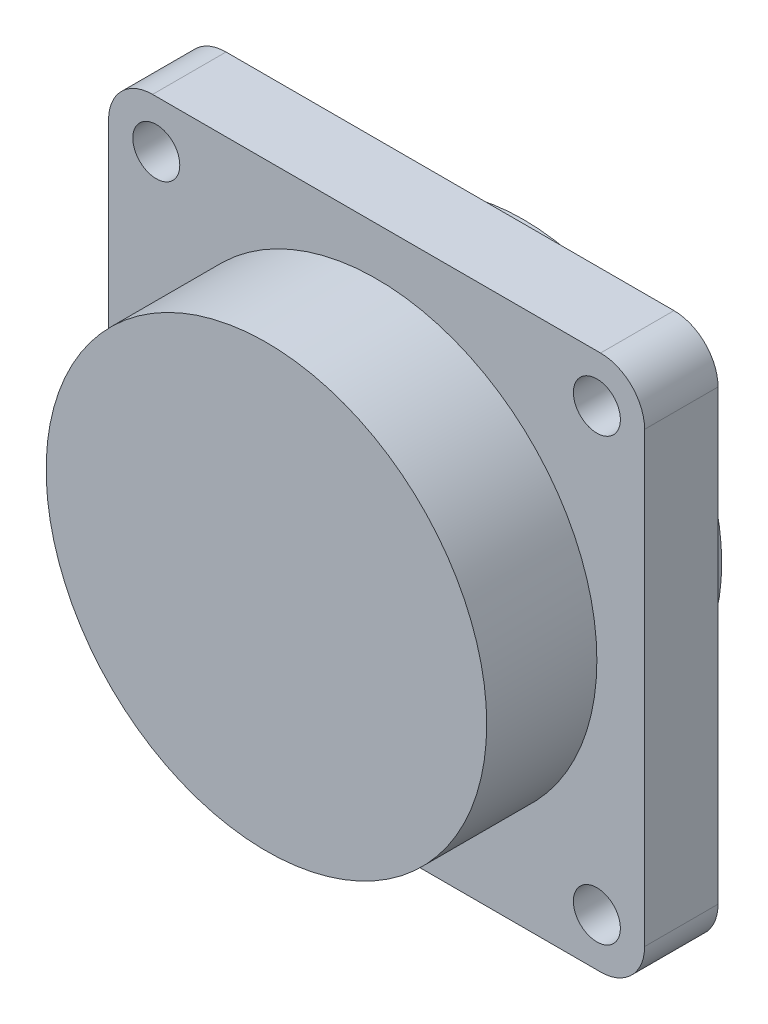
ISO-10303-21;
HEADER;
FILE_DESCRIPTION(('STEP AP214'),'2;1');
FILE_NAME('part.step','',(''),(''),'','','');
FILE_SCHEMA(('AUTOMOTIVE_DESIGN { 1 0 10303 214 1 1 1 1 }'));
ENDSEC;
DATA;
#1=APPLICATION_CONTEXT('core data for automotive mechanical design processes');
#2=APPLICATION_PROTOCOL_DEFINITION('international standard','automotive_design',2000,#1);
#3=PRODUCT_CONTEXT('',#1,'mechanical');
#4=PRODUCT('Part','Part','',(#3));
#5=PRODUCT_RELATED_PRODUCT_CATEGORY('part','',(#4));
#6=PRODUCT_DEFINITION_FORMATION('','',#4);
#7=PRODUCT_DEFINITION_CONTEXT('part definition',#1,'design');
#8=PRODUCT_DEFINITION('design','',#6,#7);
#9=PRODUCT_DEFINITION_SHAPE('','',#8);
#10=(LENGTH_UNIT() NAMED_UNIT(*) SI_UNIT(.MILLI.,.METRE.));
#11=(NAMED_UNIT(*) PLANE_ANGLE_UNIT() SI_UNIT($,.RADIAN.));
#12=(NAMED_UNIT(*) SI_UNIT($,.STERADIAN.) SOLID_ANGLE_UNIT());
#13=UNCERTAINTY_MEASURE_WITH_UNIT(LENGTH_MEASURE(1.E-05),#10,'distance_accuracy_value','');
#14=(GEOMETRIC_REPRESENTATION_CONTEXT(3) GLOBAL_UNCERTAINTY_ASSIGNED_CONTEXT((#13)) GLOBAL_UNIT_ASSIGNED_CONTEXT((#10,
#11,#12)) REPRESENTATION_CONTEXT('',''));
#15=CARTESIAN_POINT('',(0.,0.,0.));
#16=DIRECTION('',(0.,0.,1.));
#17=DIRECTION('',(1.,0.,0.));
#18=AXIS2_PLACEMENT_3D('',#15,#16,#17);
#19=CARTESIAN_POINT('',(-18.25,-18.25,0.));
#20=DIRECTION('',(0.,0.,1.));
#21=DIRECTION('',(1.,0.,0.));
#22=AXIS2_PLACEMENT_3D('',#19,#20,#21);
#23=PLANE('',#22);
#24=CARTESIAN_POINT('',(-15.,15.,0.));
#25=DIRECTION('',(0.,0.,-1.));
#26=DIRECTION('',(1.,0.,0.));
#27=AXIS2_PLACEMENT_3D('',#24,#25,#26);
#28=CIRCLE('',#27,1.6);
#29=CARTESIAN_POINT('',(-13.4,15.,0.));
#30=VERTEX_POINT('',#29);
#31=EDGE_CURVE('E155',#30,#30,#28,.T.);
#32=ORIENTED_EDGE('',*,*,#31,.F.);
#33=EDGE_LOOP('',(#32));
#34=FACE_BOUND('',#33,.T.);
#35=CARTESIAN_POINT('',(-15.,-15.,0.));
#36=DIRECTION('',(0.,0.,-1.));
#37=DIRECTION('',(-1.,0.,0.));
#38=AXIS2_PLACEMENT_3D('',#35,#36,#37);
#39=CIRCLE('',#38,1.6);
#40=CARTESIAN_POINT('',(-16.6,-15.,0.));
#41=VERTEX_POINT('',#40);
#42=EDGE_CURVE('E151',#41,#41,#39,.T.);
#43=ORIENTED_EDGE('',*,*,#42,.F.);
#44=EDGE_LOOP('',(#43));
#45=FACE_BOUND('',#44,.T.);
#46=CARTESIAN_POINT('',(15.,-15.,0.));
#47=DIRECTION('',(0.,0.,-1.));
#48=DIRECTION('',(1.,0.,0.));
#49=AXIS2_PLACEMENT_3D('',#46,#47,#48);
#50=CIRCLE('',#49,1.6);
#51=CARTESIAN_POINT('',(16.6,-15.,0.));
#52=VERTEX_POINT('',#51);
#53=EDGE_CURVE('E147',#52,#52,#50,.T.);
#54=ORIENTED_EDGE('',*,*,#53,.F.);
#55=EDGE_LOOP('',(#54));
#56=FACE_BOUND('',#55,.T.);
#57=CARTESIAN_POINT('',(15.,15.,0.));
#58=DIRECTION('',(0.,0.,-1.));
#59=DIRECTION('',(-1.,0.,0.));
#60=AXIS2_PLACEMENT_3D('',#57,#58,#59);
#61=CIRCLE('',#60,1.6);
#62=CARTESIAN_POINT('',(13.4,15.,0.));
#63=VERTEX_POINT('',#62);
#64=EDGE_CURVE('E143',#63,#63,#61,.T.);
#65=ORIENTED_EDGE('',*,*,#64,.F.);
#66=EDGE_LOOP('',(#65));
#67=FACE_BOUND('',#66,.T.);
#68=DIRECTION('',(1.,0.,0.));
#69=VECTOR('',#68,1.);
#70=CARTESIAN_POINT('',(-18.25,-18.25,0.));
#71=LINE('',#70,#69);
#72=CARTESIAN_POINT('',(-15.25,-18.25,0.));
#73=VERTEX_POINT('',#72);
#74=CARTESIAN_POINT('',(15.25,-18.25,0.));
#75=VERTEX_POINT('',#74);
#76=EDGE_CURVE('E114',#73,#75,#71,.T.);
#77=ORIENTED_EDGE('',*,*,#76,.F.);
#78=CARTESIAN_POINT('',(-15.25,-15.25,0.));
#79=DIRECTION('',(0.,0.,1.));
#80=DIRECTION('',(1.,0.,0.));
#81=AXIS2_PLACEMENT_3D('',#78,#79,#80);
#82=CIRCLE('',#81,3.);
#83=CARTESIAN_POINT('',(-18.25,-15.25,0.));
#84=VERTEX_POINT('',#83);
#85=EDGE_CURVE('E97',#73,#84,#82,.F.);
#86=ORIENTED_EDGE('',*,*,#85,.T.);
#87=DIRECTION('',(0.,-1.,0.));
#88=VECTOR('',#87,1.);
#89=CARTESIAN_POINT('',(-18.25,18.25,0.));
#90=LINE('',#89,#88);
#91=CARTESIAN_POINT('',(-18.25,15.25,0.));
#92=VERTEX_POINT('',#91);
#93=EDGE_CURVE('E124',#92,#84,#90,.T.);
#94=ORIENTED_EDGE('',*,*,#93,.F.);
#95=CARTESIAN_POINT('',(-15.25,15.25,0.));
#96=DIRECTION('',(0.,0.,1.));
#97=DIRECTION('',(1.,0.,0.));
#98=AXIS2_PLACEMENT_3D('',#95,#96,#97);
#99=CIRCLE('',#98,3.);
#100=CARTESIAN_POINT('',(-15.25,18.25,0.));
#101=VERTEX_POINT('',#100);
#102=EDGE_CURVE('E158',#92,#101,#99,.F.);
#103=ORIENTED_EDGE('',*,*,#102,.T.);
#104=DIRECTION('',(-1.,0.,0.));
#105=VECTOR('',#104,1.);
#106=CARTESIAN_POINT('',(-18.25,18.25,0.));
#107=LINE('',#106,#105);
#108=CARTESIAN_POINT('',(15.25,18.25,0.));
#109=VERTEX_POINT('',#108);
#110=EDGE_CURVE('E127',#109,#101,#107,.T.);
#111=ORIENTED_EDGE('',*,*,#110,.F.);
#112=CARTESIAN_POINT('',(15.25,15.25,0.));
#113=DIRECTION('',(0.,0.,1.));
#114=DIRECTION('',(1.,0.,0.));
#115=AXIS2_PLACEMENT_3D('',#112,#113,#114);
#116=CIRCLE('',#115,3.);
#117=CARTESIAN_POINT('',(18.25,15.25,0.));
#118=VERTEX_POINT('',#117);
#119=EDGE_CURVE('E118',#109,#118,#116,.F.);
#120=ORIENTED_EDGE('',*,*,#119,.T.);
#121=DIRECTION('',(0.,1.,0.));
#122=VECTOR('',#121,1.);
#123=CARTESIAN_POINT('',(18.25,18.25,0.));
#124=LINE('',#123,#122);
#125=CARTESIAN_POINT('',(18.25,-15.25,0.));
#126=VERTEX_POINT('',#125);
#127=EDGE_CURVE('E123',#126,#118,#124,.T.);
#128=ORIENTED_EDGE('',*,*,#127,.F.);
#129=CARTESIAN_POINT('',(15.25,-15.25,0.));
#130=DIRECTION('',(0.,0.,1.));
#131=DIRECTION('',(1.,0.,0.));
#132=AXIS2_PLACEMENT_3D('',#129,#130,#131);
#133=CIRCLE('',#132,3.);
#134=EDGE_CURVE('E108',#126,#75,#133,.F.);
#135=ORIENTED_EDGE('',*,*,#134,.T.);
#136=EDGE_LOOP('',(#77,#86,#94,#103,#111,#120,#128,#135));
#137=FACE_BOUND('',#136,.T.);
#138=CARTESIAN_POINT('',(0.,0.,0.));
#139=DIRECTION('',(0.,0.,1.));
#140=DIRECTION('',(1.,0.,0.));
#141=AXIS2_PLACEMENT_3D('',#138,#139,#140);
#142=CIRCLE('',#141,13.5);
#143=CARTESIAN_POINT('',(13.5,0.,0.));
#144=VERTEX_POINT('',#143);
#145=EDGE_CURVE('E135',#144,#144,#142,.F.);
#146=ORIENTED_EDGE('',*,*,#145,.F.);
#147=EDGE_LOOP('',(#146));
#148=FACE_BOUND('',#147,.T.);
#149=ADVANCED_FACE('F32',(#34,#45,#56,#67,#137,#148),#23,.F.);
#150=CARTESIAN_POINT('',(-18.25,-18.25,5.));
#151=DIRECTION('',(0.,0.,1.));
#152=DIRECTION('',(1.,0.,0.));
#153=AXIS2_PLACEMENT_3D('',#150,#151,#152);
#154=PLANE('',#153);
#155=CARTESIAN_POINT('',(-15.,15.,5.));
#156=DIRECTION('',(0.,0.,1.));
#157=DIRECTION('',(1.,0.,0.));
#158=AXIS2_PLACEMENT_3D('',#155,#156,#157);
#159=CIRCLE('',#158,1.6);
#160=CARTESIAN_POINT('',(-13.4,15.,5.));
#161=VERTEX_POINT('',#160);
#162=EDGE_CURVE('E152',#161,#161,#159,.T.);
#163=ORIENTED_EDGE('',*,*,#162,.F.);
#164=EDGE_LOOP('',(#163));
#165=FACE_BOUND('',#164,.T.);
#166=CARTESIAN_POINT('',(-15.,-15.,5.));
#167=DIRECTION('',(0.,0.,1.));
#168=DIRECTION('',(1.,0.,0.));
#169=AXIS2_PLACEMENT_3D('',#166,#167,#168);
#170=CIRCLE('',#169,1.6);
#171=CARTESIAN_POINT('',(-13.4,-15.,5.));
#172=VERTEX_POINT('',#171);
#173=EDGE_CURVE('E148',#172,#172,#170,.T.);
#174=ORIENTED_EDGE('',*,*,#173,.F.);
#175=EDGE_LOOP('',(#174));
#176=FACE_BOUND('',#175,.T.);
#177=CARTESIAN_POINT('',(15.,-15.,5.));
#178=DIRECTION('',(0.,0.,1.));
#179=DIRECTION('',(1.,0.,0.));
#180=AXIS2_PLACEMENT_3D('',#177,#178,#179);
#181=CIRCLE('',#180,1.6);
#182=CARTESIAN_POINT('',(16.6,-15.,5.));
#183=VERTEX_POINT('',#182);
#184=EDGE_CURVE('E144',#183,#183,#181,.T.);
#185=ORIENTED_EDGE('',*,*,#184,.F.);
#186=EDGE_LOOP('',(#185));
#187=FACE_BOUND('',#186,.T.);
#188=CARTESIAN_POINT('',(15.,15.,5.));
#189=DIRECTION('',(0.,0.,1.));
#190=DIRECTION('',(1.,0.,0.));
#191=AXIS2_PLACEMENT_3D('',#188,#189,#190);
#192=CIRCLE('',#191,1.6);
#193=CARTESIAN_POINT('',(16.6,15.,5.));
#194=VERTEX_POINT('',#193);
#195=EDGE_CURVE('E139',#194,#194,#192,.T.);
#196=ORIENTED_EDGE('',*,*,#195,.F.);
#197=EDGE_LOOP('',(#196));
#198=FACE_BOUND('',#197,.T.);
#199=DIRECTION('',(0.,-1.,0.));
#200=VECTOR('',#199,1.);
#201=CARTESIAN_POINT('',(-18.25,18.25,5.));
#202=LINE('',#201,#200);
#203=CARTESIAN_POINT('',(-18.25,15.25,5.));
#204=VERTEX_POINT('',#203);
#205=CARTESIAN_POINT('',(-18.25,-15.25,5.));
#206=VERTEX_POINT('',#205);
#207=EDGE_CURVE('E134',#204,#206,#202,.T.);
#208=ORIENTED_EDGE('',*,*,#207,.T.);
#209=CARTESIAN_POINT('',(-15.25,-15.25,5.));
#210=DIRECTION('',(0.,0.,1.));
#211=DIRECTION('',(1.,0.,0.));
#212=AXIS2_PLACEMENT_3D('',#209,#210,#211);
#213=CIRCLE('',#212,3.);
#214=CARTESIAN_POINT('',(-15.25,-18.25,5.));
#215=VERTEX_POINT('',#214);
#216=EDGE_CURVE('E169',#206,#215,#213,.T.);
#217=ORIENTED_EDGE('',*,*,#216,.T.);
#218=DIRECTION('',(1.,0.,0.));
#219=VECTOR('',#218,1.);
#220=CARTESIAN_POINT('',(-18.25,-18.25,5.));
#221=LINE('',#220,#219);
#222=CARTESIAN_POINT('',(15.25,-18.25,5.));
#223=VERTEX_POINT('',#222);
#224=EDGE_CURVE('E117',#215,#223,#221,.T.);
#225=ORIENTED_EDGE('',*,*,#224,.T.);
#226=CARTESIAN_POINT('',(15.25,-15.25,5.));
#227=DIRECTION('',(0.,0.,1.));
#228=DIRECTION('',(1.,0.,0.));
#229=AXIS2_PLACEMENT_3D('',#226,#227,#228);
#230=CIRCLE('',#229,3.);
#231=CARTESIAN_POINT('',(18.25,-15.25,5.));
#232=VERTEX_POINT('',#231);
#233=EDGE_CURVE('E167',#223,#232,#230,.T.);
#234=ORIENTED_EDGE('',*,*,#233,.T.);
#235=DIRECTION('',(0.,1.,0.));
#236=VECTOR('',#235,1.);
#237=CARTESIAN_POINT('',(18.25,18.25,5.));
#238=LINE('',#237,#236);
#239=CARTESIAN_POINT('',(18.25,15.25,5.));
#240=VERTEX_POINT('',#239);
#241=EDGE_CURVE('E189',#232,#240,#238,.T.);
#242=ORIENTED_EDGE('',*,*,#241,.T.);
#243=CARTESIAN_POINT('',(15.25,15.25,5.));
#244=DIRECTION('',(0.,0.,1.));
#245=DIRECTION('',(1.,0.,0.));
#246=AXIS2_PLACEMENT_3D('',#243,#244,#245);
#247=CIRCLE('',#246,3.);
#248=CARTESIAN_POINT('',(15.25,18.25,5.));
#249=VERTEX_POINT('',#248);
#250=EDGE_CURVE('E52',#240,#249,#247,.T.);
#251=ORIENTED_EDGE('',*,*,#250,.T.);
#252=DIRECTION('',(-1.,0.,0.));
#253=VECTOR('',#252,1.);
#254=CARTESIAN_POINT('',(-18.25,18.25,5.));
#255=LINE('',#254,#253);
#256=CARTESIAN_POINT('',(-15.25,18.25,5.));
#257=VERTEX_POINT('',#256);
#258=EDGE_CURVE('E138',#249,#257,#255,.T.);
#259=ORIENTED_EDGE('',*,*,#258,.T.);
#260=CARTESIAN_POINT('',(-15.25,15.25,5.));
#261=DIRECTION('',(0.,0.,1.));
#262=DIRECTION('',(1.,0.,0.));
#263=AXIS2_PLACEMENT_3D('',#260,#261,#262);
#264=CIRCLE('',#263,3.);
#265=EDGE_CURVE('E165',#257,#204,#264,.T.);
#266=ORIENTED_EDGE('',*,*,#265,.T.);
#267=EDGE_LOOP('',(#208,#217,#225,#234,#242,#251,#259,#266));
#268=FACE_BOUND('',#267,.T.);
#269=CARTESIAN_POINT('',(0.,0.,5.));
#270=DIRECTION('',(0.,0.,1.));
#271=DIRECTION('',(1.,0.,0.));
#272=AXIS2_PLACEMENT_3D('',#269,#270,#271);
#273=CIRCLE('',#272,15.);
#274=CARTESIAN_POINT('',(15.,0.,5.));
#275=VERTEX_POINT('',#274);
#276=EDGE_CURVE('E192',#275,#275,#273,.T.);
#277=ORIENTED_EDGE('',*,*,#276,.F.);
#278=EDGE_LOOP('',(#277));
#279=FACE_BOUND('',#278,.T.);
#280=ADVANCED_FACE('F195',(#165,#176,#187,#198,#268,#279),#154,.T.);
#281=CARTESIAN_POINT('',(-18.25,18.25,5.));
#282=DIRECTION('',(1.,0.,0.));
#283=DIRECTION('',(0.,1.,0.));
#284=AXIS2_PLACEMENT_3D('',#281,#282,#283);
#285=PLANE('',#284);
#286=ORIENTED_EDGE('',*,*,#93,.T.);
#287=DIRECTION('',(0.,0.,-1.));
#288=VECTOR('',#287,1.);
#289=CARTESIAN_POINT('',(-18.25,-15.25,5.));
#290=LINE('',#289,#288);
#291=EDGE_CURVE('E102',#84,#206,#290,.F.);
#292=ORIENTED_EDGE('',*,*,#291,.T.);
#293=ORIENTED_EDGE('',*,*,#207,.F.);
#294=DIRECTION('',(0.,0.,-1.));
#295=VECTOR('',#294,1.);
#296=CARTESIAN_POINT('',(-18.25,15.25,5.));
#297=LINE('',#296,#295);
#298=EDGE_CURVE('E107',#204,#92,#297,.T.);
#299=ORIENTED_EDGE('',*,*,#298,.T.);
#300=EDGE_LOOP('',(#286,#292,#293,#299));
#301=FACE_BOUND('',#300,.T.);
#302=ADVANCED_FACE('F186',(#301),#285,.F.);
#303=CARTESIAN_POINT('',(-18.25,-18.25,5.));
#304=DIRECTION('',(0.,1.,0.));
#305=DIRECTION('',(0.,0.,1.));
#306=AXIS2_PLACEMENT_3D('',#303,#304,#305);
#307=PLANE('',#306);
#308=ORIENTED_EDGE('',*,*,#224,.F.);
#309=DIRECTION('',(0.,0.,-1.));
#310=VECTOR('',#309,1.);
#311=CARTESIAN_POINT('',(-15.25,-18.25,5.));
#312=LINE('',#311,#310);
#313=EDGE_CURVE('E101',#215,#73,#312,.T.);
#314=ORIENTED_EDGE('',*,*,#313,.T.);
#315=ORIENTED_EDGE('',*,*,#76,.T.);
#316=DIRECTION('',(0.,0.,-1.));
#317=VECTOR('',#316,1.);
#318=CARTESIAN_POINT('',(15.25,-18.25,5.));
#319=LINE('',#318,#317);
#320=EDGE_CURVE('E119',#75,#223,#319,.F.);
#321=ORIENTED_EDGE('',*,*,#320,.T.);
#322=EDGE_LOOP('',(#308,#314,#315,#321));
#323=FACE_BOUND('',#322,.T.);
#324=ADVANCED_FACE('F113',(#323),#307,.F.);
#325=CARTESIAN_POINT('',(18.25,18.25,5.));
#326=DIRECTION('',(-1.,0.,0.));
#327=DIRECTION('',(0.,-1.,0.));
#328=AXIS2_PLACEMENT_3D('',#325,#326,#327);
#329=PLANE('',#328);
#330=ORIENTED_EDGE('',*,*,#241,.F.);
#331=DIRECTION('',(0.,0.,-1.));
#332=VECTOR('',#331,1.);
#333=CARTESIAN_POINT('',(18.25,-15.25,5.));
#334=LINE('',#333,#332);
#335=EDGE_CURVE('E173',#232,#126,#334,.T.);
#336=ORIENTED_EDGE('',*,*,#335,.T.);
#337=ORIENTED_EDGE('',*,*,#127,.T.);
#338=DIRECTION('',(0.,0.,-1.));
#339=VECTOR('',#338,1.);
#340=CARTESIAN_POINT('',(18.25,15.25,5.));
#341=LINE('',#340,#339);
#342=EDGE_CURVE('E171',#118,#240,#341,.F.);
#343=ORIENTED_EDGE('',*,*,#342,.T.);
#344=EDGE_LOOP('',(#330,#336,#337,#343));
#345=FACE_BOUND('',#344,.T.);
#346=ADVANCED_FACE('F259',(#345),#329,.F.);
#347=CARTESIAN_POINT('',(-18.25,18.25,5.));
#348=DIRECTION('',(0.,-1.,0.));
#349=DIRECTION('',(0.,0.,-1.));
#350=AXIS2_PLACEMENT_3D('',#347,#348,#349);
#351=PLANE('',#350);
#352=ORIENTED_EDGE('',*,*,#110,.T.);
#353=DIRECTION('',(0.,0.,-1.));
#354=VECTOR('',#353,1.);
#355=CARTESIAN_POINT('',(-15.25,18.25,5.));
#356=LINE('',#355,#354);
#357=EDGE_CURVE('E11',#101,#257,#356,.F.);
#358=ORIENTED_EDGE('',*,*,#357,.T.);
#359=ORIENTED_EDGE('',*,*,#258,.F.);
#360=DIRECTION('',(0.,0.,-1.));
#361=VECTOR('',#360,1.);
#362=CARTESIAN_POINT('',(15.25,18.25,5.));
#363=LINE('',#362,#361);
#364=EDGE_CURVE('E40',#249,#109,#363,.T.);
#365=ORIENTED_EDGE('',*,*,#364,.T.);
#366=EDGE_LOOP('',(#352,#358,#359,#365));
#367=FACE_BOUND('',#366,.T.);
#368=ADVANCED_FACE('F178',(#367),#351,.F.);
#369=CARTESIAN_POINT('',(0.,0.,12.5));
#370=DIRECTION('',(0.,0.,-1.));
#371=DIRECTION('',(-1.,0.,0.));
#372=AXIS2_PLACEMENT_3D('',#369,#370,#371);
#373=CYLINDRICAL_SURFACE('',#372,15.);
#374=CARTESIAN_POINT('',(0.,0.,12.5));
#375=DIRECTION('',(0.,0.,1.));
#376=DIRECTION('',(1.,0.,0.));
#377=AXIS2_PLACEMENT_3D('',#374,#375,#376);
#378=CIRCLE('',#377,15.);
#379=CARTESIAN_POINT('',(15.,0.,12.5));
#380=VERTEX_POINT('',#379);
#381=EDGE_CURVE('E129',#380,#380,#378,.T.);
#382=ORIENTED_EDGE('',*,*,#381,.F.);
#383=EDGE_LOOP('',(#382));
#384=FACE_BOUND('',#383,.T.);
#385=ORIENTED_EDGE('',*,*,#276,.T.);
#386=EDGE_LOOP('',(#385));
#387=FACE_BOUND('',#386,.T.);
#388=ADVANCED_FACE('F252',(#384,#387),#373,.T.);
#389=CARTESIAN_POINT('',(0.,0.,12.5));
#390=DIRECTION('',(0.,0.,1.));
#391=DIRECTION('',(1.,0.,0.));
#392=AXIS2_PLACEMENT_3D('',#389,#390,#391);
#393=PLANE('',#392);
#394=ORIENTED_EDGE('',*,*,#381,.T.);
#395=EDGE_LOOP('',(#394));
#396=FACE_BOUND('',#395,.T.);
#397=ADVANCED_FACE('F248',(#396),#393,.T.);
#398=CARTESIAN_POINT('',(0.,0.,-5.));
#399=DIRECTION('',(0.,0.,1.));
#400=DIRECTION('',(1.,0.,0.));
#401=AXIS2_PLACEMENT_3D('',#398,#399,#400);
#402=CYLINDRICAL_SURFACE('',#401,13.5);
#403=CARTESIAN_POINT('',(0.,0.,-5.));
#404=DIRECTION('',(0.,0.,-1.));
#405=DIRECTION('',(-1.,0.,0.));
#406=AXIS2_PLACEMENT_3D('',#403,#404,#405);
#407=CIRCLE('',#406,13.5);
#408=CARTESIAN_POINT('',(-13.5,0.,-5.));
#409=VERTEX_POINT('',#408);
#410=EDGE_CURVE('E142',#409,#409,#407,.T.);
#411=ORIENTED_EDGE('',*,*,#410,.F.);
#412=EDGE_LOOP('',(#411));
#413=FACE_BOUND('',#412,.T.);
#414=ORIENTED_EDGE('',*,*,#145,.T.);
#415=EDGE_LOOP('',(#414));
#416=FACE_BOUND('',#415,.T.);
#417=ADVANCED_FACE('F242',(#413,#416),#402,.T.);
#418=CARTESIAN_POINT('',(0.,0.,-5.));
#419=DIRECTION('',(0.,0.,-1.));
#420=DIRECTION('',(-1.,0.,0.));
#421=AXIS2_PLACEMENT_3D('',#418,#419,#420);
#422=PLANE('',#421);
#423=ORIENTED_EDGE('',*,*,#410,.T.);
#424=EDGE_LOOP('',(#423));
#425=FACE_BOUND('',#424,.T.);
#426=ADVANCED_FACE('F232',(#425),#422,.T.);
#427=CARTESIAN_POINT('',(15.,15.,12.5));
#428=DIRECTION('',(0.,0.,-1.));
#429=DIRECTION('',(-1.,0.,0.));
#430=AXIS2_PLACEMENT_3D('',#427,#428,#429);
#431=CYLINDRICAL_SURFACE('',#430,1.6);
#432=ORIENTED_EDGE('',*,*,#195,.T.);
#433=EDGE_LOOP('',(#432));
#434=FACE_BOUND('',#433,.T.);
#435=ORIENTED_EDGE('',*,*,#64,.T.);
#436=EDGE_LOOP('',(#435));
#437=FACE_BOUND('',#436,.T.);
#438=ADVANCED_FACE('F229',(#434,#437),#431,.F.);
#439=CARTESIAN_POINT('',(15.,-15.,12.5));
#440=DIRECTION('',(0.,0.,-1.));
#441=DIRECTION('',(-1.,0.,0.));
#442=AXIS2_PLACEMENT_3D('',#439,#440,#441);
#443=CYLINDRICAL_SURFACE('',#442,1.6);
#444=ORIENTED_EDGE('',*,*,#184,.T.);
#445=EDGE_LOOP('',(#444));
#446=FACE_BOUND('',#445,.T.);
#447=ORIENTED_EDGE('',*,*,#53,.T.);
#448=EDGE_LOOP('',(#447));
#449=FACE_BOUND('',#448,.T.);
#450=ADVANCED_FACE('F231',(#446,#449),#443,.F.);
#451=CARTESIAN_POINT('',(-15.,-15.,12.5));
#452=DIRECTION('',(0.,0.,-1.));
#453=DIRECTION('',(-1.,0.,0.));
#454=AXIS2_PLACEMENT_3D('',#451,#452,#453);
#455=CYLINDRICAL_SURFACE('',#454,1.6);
#456=ORIENTED_EDGE('',*,*,#173,.T.);
#457=EDGE_LOOP('',(#456));
#458=FACE_BOUND('',#457,.T.);
#459=ORIENTED_EDGE('',*,*,#42,.T.);
#460=EDGE_LOOP('',(#459));
#461=FACE_BOUND('',#460,.T.);
#462=ADVANCED_FACE('F239',(#458,#461),#455,.F.);
#463=CARTESIAN_POINT('',(-15.,15.,12.5));
#464=DIRECTION('',(0.,0.,-1.));
#465=DIRECTION('',(-1.,0.,0.));
#466=AXIS2_PLACEMENT_3D('',#463,#464,#465);
#467=CYLINDRICAL_SURFACE('',#466,1.6);
#468=ORIENTED_EDGE('',*,*,#162,.T.);
#469=EDGE_LOOP('',(#468));
#470=FACE_BOUND('',#469,.T.);
#471=ORIENTED_EDGE('',*,*,#31,.T.);
#472=EDGE_LOOP('',(#471));
#473=FACE_BOUND('',#472,.T.);
#474=ADVANCED_FACE('F218',(#470,#473),#467,.F.);
#475=CARTESIAN_POINT('',(-15.25,-15.25,5.));
#476=DIRECTION('',(0.,0.,-1.));
#477=DIRECTION('',(-1.,0.,0.));
#478=AXIS2_PLACEMENT_3D('',#475,#476,#477);
#479=CYLINDRICAL_SURFACE('',#478,3.);
#480=ORIENTED_EDGE('',*,*,#216,.F.);
#481=ORIENTED_EDGE('',*,*,#291,.F.);
#482=ORIENTED_EDGE('',*,*,#85,.F.);
#483=ORIENTED_EDGE('',*,*,#313,.F.);
#484=EDGE_LOOP('',(#480,#481,#482,#483));
#485=FACE_BOUND('',#484,.T.);
#486=ADVANCED_FACE('F100',(#485),#479,.T.);
#487=CARTESIAN_POINT('',(15.25,-15.25,5.));
#488=DIRECTION('',(0.,0.,-1.));
#489=DIRECTION('',(-1.,0.,0.));
#490=AXIS2_PLACEMENT_3D('',#487,#488,#489);
#491=CYLINDRICAL_SURFACE('',#490,3.);
#492=ORIENTED_EDGE('',*,*,#233,.F.);
#493=ORIENTED_EDGE('',*,*,#320,.F.);
#494=ORIENTED_EDGE('',*,*,#134,.F.);
#495=ORIENTED_EDGE('',*,*,#335,.F.);
#496=EDGE_LOOP('',(#492,#493,#494,#495));
#497=FACE_BOUND('',#496,.T.);
#498=ADVANCED_FACE('F269',(#497),#491,.T.);
#499=CARTESIAN_POINT('',(-15.25,15.25,5.));
#500=DIRECTION('',(0.,0.,-1.));
#501=DIRECTION('',(-1.,0.,0.));
#502=AXIS2_PLACEMENT_3D('',#499,#500,#501);
#503=CYLINDRICAL_SURFACE('',#502,3.);
#504=ORIENTED_EDGE('',*,*,#265,.F.);
#505=ORIENTED_EDGE('',*,*,#357,.F.);
#506=ORIENTED_EDGE('',*,*,#102,.F.);
#507=ORIENTED_EDGE('',*,*,#298,.F.);
#508=EDGE_LOOP('',(#504,#505,#506,#507));
#509=FACE_BOUND('',#508,.T.);
#510=ADVANCED_FACE('F183',(#509),#503,.T.);
#511=CARTESIAN_POINT('',(15.25,15.25,5.));
#512=DIRECTION('',(0.,0.,-1.));
#513=DIRECTION('',(-1.,0.,0.));
#514=AXIS2_PLACEMENT_3D('',#511,#512,#513);
#515=CYLINDRICAL_SURFACE('',#514,3.);
#516=ORIENTED_EDGE('',*,*,#250,.F.);
#517=ORIENTED_EDGE('',*,*,#342,.F.);
#518=ORIENTED_EDGE('',*,*,#119,.F.);
#519=ORIENTED_EDGE('',*,*,#364,.F.);
#520=EDGE_LOOP('',(#516,#517,#518,#519));
#521=FACE_BOUND('',#520,.T.);
#522=ADVANCED_FACE('F34',(#521),#515,.T.);
#523=CLOSED_SHELL('',(#149,#280,#302,#324,#346,#368,#388,#397,#417,#426,#438,#450,#462,#474,
#486,#498,#510,#522));
#524=MANIFOLD_SOLID_BREP('B2',#523);
#525=ADVANCED_BREP_SHAPE_REPRESENTATION('',(#18,#524),#14);
#526=SHAPE_DEFINITION_REPRESENTATION(#9,#525);
ENDSEC;
END-ISO-10303-21;
